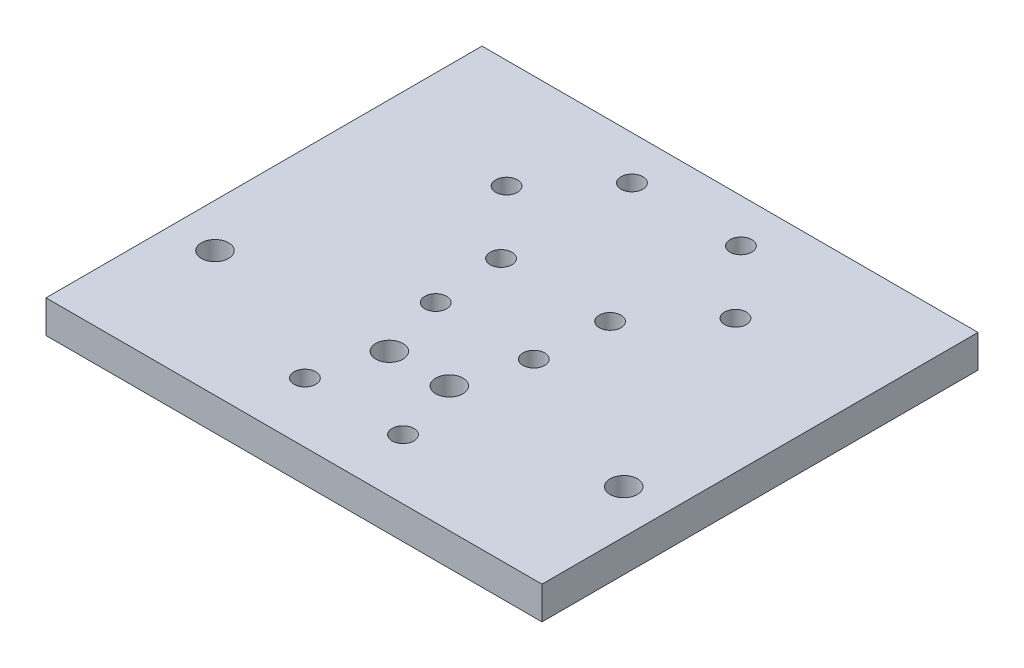
ISO-10303-21;
HEADER;
FILE_DESCRIPTION(('STEP AP214'),'2;1');
FILE_NAME('part.step','',(''),(''),'','','');
FILE_SCHEMA(('AUTOMOTIVE_DESIGN { 1 0 10303 214 1 1 1 1 }'));
ENDSEC;
DATA;
#1=APPLICATION_CONTEXT('core data for automotive mechanical design processes');
#2=APPLICATION_PROTOCOL_DEFINITION('international standard','automotive_design',2000,#1);
#3=PRODUCT_CONTEXT('',#1,'mechanical');
#4=PRODUCT('Part','Part','',(#3));
#5=PRODUCT_RELATED_PRODUCT_CATEGORY('part','',(#4));
#6=PRODUCT_DEFINITION_FORMATION('','',#4);
#7=PRODUCT_DEFINITION_CONTEXT('part definition',#1,'design');
#8=PRODUCT_DEFINITION('design','',#6,#7);
#9=PRODUCT_DEFINITION_SHAPE('','',#8);
#10=(LENGTH_UNIT() NAMED_UNIT(*) SI_UNIT(.MILLI.,.METRE.));
#11=(NAMED_UNIT(*) PLANE_ANGLE_UNIT() SI_UNIT($,.RADIAN.));
#12=(NAMED_UNIT(*) SI_UNIT($,.STERADIAN.) SOLID_ANGLE_UNIT());
#13=UNCERTAINTY_MEASURE_WITH_UNIT(LENGTH_MEASURE(1.E-05),#10,'distance_accuracy_value','');
#14=(GEOMETRIC_REPRESENTATION_CONTEXT(3) GLOBAL_UNCERTAINTY_ASSIGNED_CONTEXT((#13)) GLOBAL_UNIT_ASSIGNED_CONTEXT((#10,
#11,#12)) REPRESENTATION_CONTEXT('',''));
#15=CARTESIAN_POINT('',(0.,0.,0.));
#16=DIRECTION('',(0.,0.,1.));
#17=DIRECTION('',(1.,0.,0.));
#18=AXIS2_PLACEMENT_3D('',#15,#16,#17);
#19=CARTESIAN_POINT('',(104.,0.,0.));
#20=DIRECTION('',(0.,0.,-1.));
#21=DIRECTION('',(-1.,0.,0.));
#22=AXIS2_PLACEMENT_3D('',#19,#20,#21);
#23=PLANE('',#22);
#24=DIRECTION('',(-1.,0.,0.));
#25=VECTOR('',#24,1.);
#26=CARTESIAN_POINT('',(104.,0.,0.));
#27=LINE('',#26,#25);
#28=CARTESIAN_POINT('',(97.5,0.,0.));
#29=VERTEX_POINT('',#28);
#30=CARTESIAN_POINT('',(6.50000000000003,0.,0.));
#31=VERTEX_POINT('',#30);
#32=EDGE_CURVE('E11',#29,#31,#27,.T.);
#33=ORIENTED_EDGE('',*,*,#32,.F.);
#34=DIRECTION('',(0.,1.,0.));
#35=VECTOR('',#34,1.);
#36=CARTESIAN_POINT('',(97.5,0.,0.));
#37=LINE('',#36,#35);
#38=CARTESIAN_POINT('',(97.5,6.,0.));
#39=VERTEX_POINT('',#38);
#40=EDGE_CURVE('E104',#29,#39,#37,.T.);
#41=ORIENTED_EDGE('',*,*,#40,.T.);
#42=DIRECTION('',(-1.,0.,0.));
#43=VECTOR('',#42,1.);
#44=CARTESIAN_POINT('',(104.,6.,0.));
#45=LINE('',#44,#43);
#46=CARTESIAN_POINT('',(6.50000000000005,6.,0.));
#47=VERTEX_POINT('',#46);
#48=EDGE_CURVE('E93',#39,#47,#45,.T.);
#49=ORIENTED_EDGE('',*,*,#48,.T.);
#50=DIRECTION('',(0.,1.,0.));
#51=VECTOR('',#50,1.);
#52=CARTESIAN_POINT('',(6.50000000000003,0.,0.));
#53=LINE('',#52,#51);
#54=EDGE_CURVE('E62',#31,#47,#53,.T.);
#55=ORIENTED_EDGE('',*,*,#54,.F.);
#56=EDGE_LOOP('',(#33,#41,#49,#55));
#57=FACE_BOUND('',#56,.T.);
#58=ADVANCED_FACE('F39',(#57),#23,.F.);
#59=CARTESIAN_POINT('',(104.,0.,0.));
#60=DIRECTION('',(0.,1.,0.));
#61=DIRECTION('',(0.,0.,1.));
#62=AXIS2_PLACEMENT_3D('',#59,#60,#61);
#63=PLANE('',#62);
#64=CARTESIAN_POINT('',(61.,0.,-11.));
#65=DIRECTION('',(0.,1.,0.));
#66=DIRECTION('',(0.,0.,-1.));
#67=AXIS2_PLACEMENT_3D('',#64,#65,#66);
#68=CIRCLE('',#67,2.);
#69=CARTESIAN_POINT('',(61.,0.,-13.));
#70=VERTEX_POINT('',#69);
#71=EDGE_CURVE('E320',#70,#70,#68,.T.);
#72=ORIENTED_EDGE('',*,*,#71,.T.);
#73=EDGE_LOOP('',(#72));
#74=FACE_BOUND('',#73,.T.);
#75=CARTESIAN_POINT('',(61.0000000000001,0.,-35.));
#76=DIRECTION('',(0.,1.,0.));
#77=DIRECTION('',(0.,0.,-1.));
#78=AXIS2_PLACEMENT_3D('',#75,#76,#77);
#79=CIRCLE('',#78,1.99999999999999);
#80=CARTESIAN_POINT('',(61.0000000000001,0.,-37.));
#81=VERTEX_POINT('',#80);
#82=EDGE_CURVE('E312',#81,#81,#79,.T.);
#83=ORIENTED_EDGE('',*,*,#82,.T.);
#84=EDGE_LOOP('',(#83));
#85=FACE_BOUND('',#84,.T.);
#86=CARTESIAN_POINT('',(62.,0.,-48.));
#87=DIRECTION('',(0.,1.,0.));
#88=DIRECTION('',(0.,0.,-1.));
#89=AXIS2_PLACEMENT_3D('',#86,#87,#88);
#90=CIRCLE('',#89,1.99999999999998);
#91=CARTESIAN_POINT('',(62.,0.,-50.));
#92=VERTEX_POINT('',#91);
#93=EDGE_CURVE('E304',#92,#92,#90,.T.);
#94=ORIENTED_EDGE('',*,*,#93,.T.);
#95=EDGE_LOOP('',(#94));
#96=FACE_BOUND('',#95,.T.);
#97=CARTESIAN_POINT('',(62.,0.,-72.));
#98=DIRECTION('',(0.,1.,0.));
#99=DIRECTION('',(0.,0.,-1.));
#100=AXIS2_PLACEMENT_3D('',#97,#98,#99);
#101=CIRCLE('',#100,2.);
#102=CARTESIAN_POINT('',(62.,0.,-74.));
#103=VERTEX_POINT('',#102);
#104=EDGE_CURVE('E228',#103,#103,#101,.T.);
#105=ORIENTED_EDGE('',*,*,#104,.T.);
#106=EDGE_LOOP('',(#105));
#107=FACE_BOUND('',#106,.T.);
#108=CARTESIAN_POINT('',(42.9999999999999,0.,-35.));
#109=DIRECTION('',(0.,1.,0.));
#110=DIRECTION('',(0.,0.,1.));
#111=AXIS2_PLACEMENT_3D('',#108,#109,#110);
#112=CIRCLE('',#111,2.);
#113=CARTESIAN_POINT('',(42.9999999999999,0.,-33.));
#114=VERTEX_POINT('',#113);
#115=EDGE_CURVE('E122',#114,#114,#112,.T.);
#116=ORIENTED_EDGE('',*,*,#115,.T.);
#117=EDGE_LOOP('',(#116));
#118=FACE_BOUND('',#117,.T.);
#119=CARTESIAN_POINT('',(42.,0.,-48.));
#120=DIRECTION('',(0.,1.,0.));
#121=DIRECTION('',(0.,0.,1.));
#122=AXIS2_PLACEMENT_3D('',#119,#120,#121);
#123=CIRCLE('',#122,2.);
#124=CARTESIAN_POINT('',(42.,0.,-46.));
#125=VERTEX_POINT('',#124);
#126=EDGE_CURVE('E106',#125,#125,#123,.T.);
#127=ORIENTED_EDGE('',*,*,#126,.T.);
#128=EDGE_LOOP('',(#127));
#129=FACE_BOUND('',#128,.T.);
#130=CARTESIAN_POINT('',(42.,0.,-72.));
#131=DIRECTION('',(0.,1.,0.));
#132=DIRECTION('',(0.,0.,1.));
#133=AXIS2_PLACEMENT_3D('',#130,#131,#132);
#134=CIRCLE('',#133,2.);
#135=CARTESIAN_POINT('',(42.,0.,-70.));
#136=VERTEX_POINT('',#135);
#137=EDGE_CURVE('E222',#136,#136,#134,.T.);
#138=ORIENTED_EDGE('',*,*,#137,.T.);
#139=EDGE_LOOP('',(#138));
#140=FACE_BOUND('',#139,.T.);
#141=CARTESIAN_POINT('',(73.,0.,-60.));
#142=DIRECTION('',(0.,1.,0.));
#143=DIRECTION('',(0.,0.,1.));
#144=AXIS2_PLACEMENT_3D('',#141,#142,#143);
#145=CIRCLE('',#144,2.);
#146=CARTESIAN_POINT('',(73.,0.,-58.));
#147=VERTEX_POINT('',#146);
#148=EDGE_CURVE('E337',#147,#147,#145,.T.);
#149=ORIENTED_EDGE('',*,*,#148,.T.);
#150=EDGE_LOOP('',(#149));
#151=FACE_BOUND('',#150,.T.);
#152=CARTESIAN_POINT('',(31.,0.,-60.));
#153=DIRECTION('',(0.,1.,0.));
#154=DIRECTION('',(0.,0.,1.));
#155=AXIS2_PLACEMENT_3D('',#152,#153,#154);
#156=CIRCLE('',#155,2.00000000000001);
#157=CARTESIAN_POINT('',(31.,0.,-58.));
#158=VERTEX_POINT('',#157);
#159=EDGE_CURVE('E341',#158,#158,#156,.T.);
#160=ORIENTED_EDGE('',*,*,#159,.T.);
#161=EDGE_LOOP('',(#160));
#162=FACE_BOUND('',#161,.T.);
#163=CARTESIAN_POINT('',(14.5,0.,-23.));
#164=DIRECTION('',(0.,1.,0.));
#165=DIRECTION('',(0.,0.,-1.));
#166=AXIS2_PLACEMENT_3D('',#163,#164,#165);
#167=CIRCLE('',#166,2.5);
#168=CARTESIAN_POINT('',(14.5,0.,-25.5));
#169=VERTEX_POINT('',#168);
#170=EDGE_CURVE('E295',#169,#169,#167,.T.);
#171=ORIENTED_EDGE('',*,*,#170,.T.);
#172=EDGE_LOOP('',(#171));
#173=FACE_BOUND('',#172,.T.);
#174=CARTESIAN_POINT('',(46.5,0.,-23.));
#175=DIRECTION('',(0.,1.,0.));
#176=DIRECTION('',(0.,0.,-1.));
#177=AXIS2_PLACEMENT_3D('',#174,#175,#176);
#178=CIRCLE('',#177,2.49999999999999);
#179=CARTESIAN_POINT('',(46.5,0.,-25.5));
#180=VERTEX_POINT('',#179);
#181=EDGE_CURVE('E289',#180,#180,#178,.T.);
#182=ORIENTED_EDGE('',*,*,#181,.T.);
#183=EDGE_LOOP('',(#182));
#184=FACE_BOUND('',#183,.T.);
#185=CARTESIAN_POINT('',(89.5,0.,-23.));
#186=DIRECTION('',(0.,1.,0.));
#187=DIRECTION('',(0.,0.,1.));
#188=AXIS2_PLACEMENT_3D('',#185,#186,#187);
#189=CIRCLE('',#188,2.5);
#190=CARTESIAN_POINT('',(89.5,0.,-20.5));
#191=VERTEX_POINT('',#190);
#192=EDGE_CURVE('E276',#191,#191,#189,.T.);
#193=ORIENTED_EDGE('',*,*,#192,.T.);
#194=EDGE_LOOP('',(#193));
#195=FACE_BOUND('',#194,.T.);
#196=CARTESIAN_POINT('',(57.5,0.,-23.));
#197=DIRECTION('',(0.,1.,0.));
#198=DIRECTION('',(0.,0.,1.));
#199=AXIS2_PLACEMENT_3D('',#196,#197,#198);
#200=CIRCLE('',#199,2.49999999999999);
#201=CARTESIAN_POINT('',(57.5,0.,-20.5));
#202=VERTEX_POINT('',#201);
#203=EDGE_CURVE('E275',#202,#202,#200,.T.);
#204=ORIENTED_EDGE('',*,*,#203,.T.);
#205=EDGE_LOOP('',(#204));
#206=FACE_BOUND('',#205,.T.);
#207=CARTESIAN_POINT('',(43.,0.,-11.));
#208=DIRECTION('',(0.,1.,0.));
#209=DIRECTION('',(0.,0.,1.));
#210=AXIS2_PLACEMENT_3D('',#207,#208,#209);
#211=CIRCLE('',#210,2.);
#212=CARTESIAN_POINT('',(43.,0.,-9.00000000000001));
#213=VERTEX_POINT('',#212);
#214=EDGE_CURVE('E114',#213,#213,#211,.T.);
#215=ORIENTED_EDGE('',*,*,#214,.T.);
#216=EDGE_LOOP('',(#215));
#217=FACE_BOUND('',#216,.T.);
#218=DIRECTION('',(-1.,0.,0.));
#219=VECTOR('',#218,1.);
#220=CARTESIAN_POINT('',(104.,0.,-80.));
#221=LINE('',#220,#219);
#222=CARTESIAN_POINT('',(97.5,0.,-80.));
#223=VERTEX_POINT('',#222);
#224=CARTESIAN_POINT('',(6.50000000000002,0.,-80.));
#225=VERTEX_POINT('',#224);
#226=EDGE_CURVE('E47',#223,#225,#221,.T.);
#227=ORIENTED_EDGE('',*,*,#226,.F.);
#228=DIRECTION('',(0.,0.,1.));
#229=VECTOR('',#228,1.);
#230=CARTESIAN_POINT('',(97.5,0.,-80.));
#231=LINE('',#230,#229);
#232=EDGE_CURVE('E98',#223,#29,#231,.T.);
#233=ORIENTED_EDGE('',*,*,#232,.T.);
#234=ORIENTED_EDGE('',*,*,#32,.T.);
#235=DIRECTION('',(0.,0.,-1.));
#236=VECTOR('',#235,1.);
#237=CARTESIAN_POINT('',(6.50000000000002,0.,-80.));
#238=LINE('',#237,#236);
#239=EDGE_CURVE('E78',#31,#225,#238,.T.);
#240=ORIENTED_EDGE('',*,*,#239,.T.);
#241=EDGE_LOOP('',(#227,#233,#234,#240));
#242=FACE_BOUND('',#241,.T.);
#243=ADVANCED_FACE('F97',(#74,#85,#96,#107,#118,#129,#140,#151,#162,#173,#184,#195,#206,#217,
#242),#63,.F.);
#244=CARTESIAN_POINT('',(104.,0.,-80.));
#245=DIRECTION('',(0.,0.,1.));
#246=DIRECTION('',(1.,0.,0.));
#247=AXIS2_PLACEMENT_3D('',#244,#245,#246);
#248=PLANE('',#247);
#249=DIRECTION('',(-1.,0.,0.));
#250=VECTOR('',#249,1.);
#251=CARTESIAN_POINT('',(104.,6.,-80.));
#252=LINE('',#251,#250);
#253=CARTESIAN_POINT('',(97.5,6.,-80.));
#254=VERTEX_POINT('',#253);
#255=CARTESIAN_POINT('',(6.50000000000002,6.,-80.));
#256=VERTEX_POINT('',#255);
#257=EDGE_CURVE('E125',#254,#256,#252,.T.);
#258=ORIENTED_EDGE('',*,*,#257,.F.);
#259=DIRECTION('',(0.,1.,0.));
#260=VECTOR('',#259,1.);
#261=CARTESIAN_POINT('',(97.5,0.,-80.));
#262=LINE('',#261,#260);
#263=EDGE_CURVE('E54',#223,#254,#262,.T.);
#264=ORIENTED_EDGE('',*,*,#263,.F.);
#265=ORIENTED_EDGE('',*,*,#226,.T.);
#266=DIRECTION('',(0.,1.,0.));
#267=VECTOR('',#266,1.);
#268=CARTESIAN_POINT('',(6.50000000000002,0.,-80.));
#269=LINE('',#268,#267);
#270=EDGE_CURVE('E81',#225,#256,#269,.T.);
#271=ORIENTED_EDGE('',*,*,#270,.T.);
#272=EDGE_LOOP('',(#258,#264,#265,#271));
#273=FACE_BOUND('',#272,.T.);
#274=ADVANCED_FACE('F131',(#273),#248,.F.);
#275=CARTESIAN_POINT('',(104.,6.,0.));
#276=DIRECTION('',(0.,-1.,0.));
#277=DIRECTION('',(0.,0.,-1.));
#278=AXIS2_PLACEMENT_3D('',#275,#276,#277);
#279=PLANE('',#278);
#280=CARTESIAN_POINT('',(61.,6.,-11.));
#281=DIRECTION('',(0.,1.,0.));
#282=DIRECTION('',(0.,0.,-1.));
#283=AXIS2_PLACEMENT_3D('',#280,#281,#282);
#284=CIRCLE('',#283,2.);
#285=CARTESIAN_POINT('',(61.,6.,-13.));
#286=VERTEX_POINT('',#285);
#287=EDGE_CURVE('E281',#286,#286,#284,.T.);
#288=ORIENTED_EDGE('',*,*,#287,.F.);
#289=EDGE_LOOP('',(#288));
#290=FACE_BOUND('',#289,.T.);
#291=CARTESIAN_POINT('',(61.0000000000001,6.,-35.));
#292=DIRECTION('',(0.,1.,0.));
#293=DIRECTION('',(0.,0.,-1.));
#294=AXIS2_PLACEMENT_3D('',#291,#292,#293);
#295=CIRCLE('',#294,1.99999999999999);
#296=CARTESIAN_POINT('',(61.0000000000001,6.,-37.));
#297=VERTEX_POINT('',#296);
#298=EDGE_CURVE('E316',#297,#297,#295,.T.);
#299=ORIENTED_EDGE('',*,*,#298,.F.);
#300=EDGE_LOOP('',(#299));
#301=FACE_BOUND('',#300,.T.);
#302=CARTESIAN_POINT('',(62.,6.,-48.));
#303=DIRECTION('',(0.,1.,0.));
#304=DIRECTION('',(0.,0.,-1.));
#305=AXIS2_PLACEMENT_3D('',#302,#303,#304);
#306=CIRCLE('',#305,1.99999999999998);
#307=CARTESIAN_POINT('',(62.,6.,-50.));
#308=VERTEX_POINT('',#307);
#309=EDGE_CURVE('E308',#308,#308,#306,.T.);
#310=ORIENTED_EDGE('',*,*,#309,.F.);
#311=EDGE_LOOP('',(#310));
#312=FACE_BOUND('',#311,.T.);
#313=CARTESIAN_POINT('',(62.,6.,-72.));
#314=DIRECTION('',(0.,1.,0.));
#315=DIRECTION('',(0.,0.,-1.));
#316=AXIS2_PLACEMENT_3D('',#313,#314,#315);
#317=CIRCLE('',#316,2.);
#318=CARTESIAN_POINT('',(62.,6.,-74.));
#319=VERTEX_POINT('',#318);
#320=EDGE_CURVE('E235',#319,#319,#317,.T.);
#321=ORIENTED_EDGE('',*,*,#320,.F.);
#322=EDGE_LOOP('',(#321));
#323=FACE_BOUND('',#322,.T.);
#324=CARTESIAN_POINT('',(42.9999999999999,6.,-35.));
#325=DIRECTION('',(0.,1.,0.));
#326=DIRECTION('',(0.,0.,1.));
#327=AXIS2_PLACEMENT_3D('',#324,#325,#326);
#328=CIRCLE('',#327,2.);
#329=CARTESIAN_POINT('',(42.9999999999999,6.,-33.));
#330=VERTEX_POINT('',#329);
#331=EDGE_CURVE('E109',#330,#330,#328,.T.);
#332=ORIENTED_EDGE('',*,*,#331,.F.);
#333=EDGE_LOOP('',(#332));
#334=FACE_BOUND('',#333,.T.);
#335=CARTESIAN_POINT('',(42.,6.,-48.));
#336=DIRECTION('',(0.,1.,0.));
#337=DIRECTION('',(0.,0.,1.));
#338=AXIS2_PLACEMENT_3D('',#335,#336,#337);
#339=CIRCLE('',#338,2.);
#340=CARTESIAN_POINT('',(42.,6.,-46.));
#341=VERTEX_POINT('',#340);
#342=EDGE_CURVE('E232',#341,#341,#339,.T.);
#343=ORIENTED_EDGE('',*,*,#342,.F.);
#344=EDGE_LOOP('',(#343));
#345=FACE_BOUND('',#344,.T.);
#346=CARTESIAN_POINT('',(42.,6.,-72.));
#347=DIRECTION('',(0.,1.,0.));
#348=DIRECTION('',(0.,0.,1.));
#349=AXIS2_PLACEMENT_3D('',#346,#347,#348);
#350=CIRCLE('',#349,2.);
#351=CARTESIAN_POINT('',(42.,6.,-70.));
#352=VERTEX_POINT('',#351);
#353=EDGE_CURVE('E225',#352,#352,#350,.T.);
#354=ORIENTED_EDGE('',*,*,#353,.F.);
#355=EDGE_LOOP('',(#354));
#356=FACE_BOUND('',#355,.T.);
#357=CARTESIAN_POINT('',(73.,6.,-60.));
#358=DIRECTION('',(0.,1.,0.));
#359=DIRECTION('',(0.,0.,1.));
#360=AXIS2_PLACEMENT_3D('',#357,#358,#359);
#361=CIRCLE('',#360,2.);
#362=CARTESIAN_POINT('',(73.,6.,-58.));
#363=VERTEX_POINT('',#362);
#364=EDGE_CURVE('E254',#363,#363,#361,.T.);
#365=ORIENTED_EDGE('',*,*,#364,.F.);
#366=EDGE_LOOP('',(#365));
#367=FACE_BOUND('',#366,.T.);
#368=CARTESIAN_POINT('',(31.,6.,-60.));
#369=DIRECTION('',(0.,1.,0.));
#370=DIRECTION('',(0.,0.,1.));
#371=AXIS2_PLACEMENT_3D('',#368,#369,#370);
#372=CIRCLE('',#371,2.00000000000001);
#373=CARTESIAN_POINT('',(31.,6.,-58.));
#374=VERTEX_POINT('',#373);
#375=EDGE_CURVE('E258',#374,#374,#372,.T.);
#376=ORIENTED_EDGE('',*,*,#375,.F.);
#377=EDGE_LOOP('',(#376));
#378=FACE_BOUND('',#377,.T.);
#379=CARTESIAN_POINT('',(14.5,6.,-23.));
#380=DIRECTION('',(0.,1.,0.));
#381=DIRECTION('',(0.,0.,-1.));
#382=AXIS2_PLACEMENT_3D('',#379,#380,#381);
#383=CIRCLE('',#382,2.5);
#384=CARTESIAN_POINT('',(14.5,6.,-25.5));
#385=VERTEX_POINT('',#384);
#386=EDGE_CURVE('E262',#385,#385,#383,.T.);
#387=ORIENTED_EDGE('',*,*,#386,.F.);
#388=EDGE_LOOP('',(#387));
#389=FACE_BOUND('',#388,.T.);
#390=CARTESIAN_POINT('',(46.5,6.,-23.));
#391=DIRECTION('',(0.,1.,0.));
#392=DIRECTION('',(0.,0.,-1.));
#393=AXIS2_PLACEMENT_3D('',#390,#391,#392);
#394=CIRCLE('',#393,2.49999999999999);
#395=CARTESIAN_POINT('',(46.5,6.,-25.5));
#396=VERTEX_POINT('',#395);
#397=EDGE_CURVE('E266',#396,#396,#394,.T.);
#398=ORIENTED_EDGE('',*,*,#397,.F.);
#399=EDGE_LOOP('',(#398));
#400=FACE_BOUND('',#399,.T.);
#401=CARTESIAN_POINT('',(89.5,6.,-23.));
#402=DIRECTION('',(0.,1.,0.));
#403=DIRECTION('',(0.,0.,1.));
#404=AXIS2_PLACEMENT_3D('',#401,#402,#403);
#405=CIRCLE('',#404,2.5);
#406=CARTESIAN_POINT('',(89.5,6.,-20.5));
#407=VERTEX_POINT('',#406);
#408=EDGE_CURVE('E270',#407,#407,#405,.T.);
#409=ORIENTED_EDGE('',*,*,#408,.F.);
#410=EDGE_LOOP('',(#409));
#411=FACE_BOUND('',#410,.T.);
#412=CARTESIAN_POINT('',(57.5,6.,-23.));
#413=DIRECTION('',(0.,1.,0.));
#414=DIRECTION('',(0.,0.,1.));
#415=AXIS2_PLACEMENT_3D('',#412,#413,#414);
#416=CIRCLE('',#415,2.49999999999999);
#417=CARTESIAN_POINT('',(57.5,6.,-20.5));
#418=VERTEX_POINT('',#417);
#419=EDGE_CURVE('E273',#418,#418,#416,.T.);
#420=ORIENTED_EDGE('',*,*,#419,.F.);
#421=EDGE_LOOP('',(#420));
#422=FACE_BOUND('',#421,.T.);
#423=CARTESIAN_POINT('',(43.,6.,-11.));
#424=DIRECTION('',(0.,1.,0.));
#425=DIRECTION('',(0.,0.,1.));
#426=AXIS2_PLACEMENT_3D('',#423,#424,#425);
#427=CIRCLE('',#426,2.);
#428=CARTESIAN_POINT('',(43.,6.,-9.00000000000001));
#429=VERTEX_POINT('',#428);
#430=EDGE_CURVE('E118',#429,#429,#427,.T.);
#431=ORIENTED_EDGE('',*,*,#430,.F.);
#432=EDGE_LOOP('',(#431));
#433=FACE_BOUND('',#432,.T.);
#434=ORIENTED_EDGE('',*,*,#48,.F.);
#435=DIRECTION('',(0.,0.,1.));
#436=VECTOR('',#435,1.);
#437=CARTESIAN_POINT('',(97.5,6.,-80.));
#438=LINE('',#437,#436);
#439=EDGE_CURVE('E100',#254,#39,#438,.T.);
#440=ORIENTED_EDGE('',*,*,#439,.F.);
#441=ORIENTED_EDGE('',*,*,#257,.T.);
#442=DIRECTION('',(0.,0.,-1.));
#443=VECTOR('',#442,1.);
#444=CARTESIAN_POINT('',(6.50000000000002,6.,-80.));
#445=LINE('',#444,#443);
#446=EDGE_CURVE('E86',#47,#256,#445,.T.);
#447=ORIENTED_EDGE('',*,*,#446,.F.);
#448=EDGE_LOOP('',(#434,#440,#441,#447));
#449=FACE_BOUND('',#448,.T.);
#450=ADVANCED_FACE('F133',(#290,#301,#312,#323,#334,#345,#356,#367,#378,#389,#400,#411,#422,
#433,#449),#279,.F.);
#451=CARTESIAN_POINT('',(43.,0.,-11.));
#452=DIRECTION('',(0.,1.,0.));
#453=DIRECTION('',(0.,0.,1.));
#454=AXIS2_PLACEMENT_3D('',#451,#452,#453);
#455=CYLINDRICAL_SURFACE('',#454,2.);
#456=ORIENTED_EDGE('',*,*,#214,.F.);
#457=EDGE_LOOP('',(#456));
#458=FACE_BOUND('',#457,.T.);
#459=ORIENTED_EDGE('',*,*,#430,.T.);
#460=EDGE_LOOP('',(#459));
#461=FACE_BOUND('',#460,.T.);
#462=ADVANCED_FACE('F163',(#458,#461),#455,.F.);
#463=CARTESIAN_POINT('',(57.5,0.,-23.));
#464=DIRECTION('',(0.,1.,0.));
#465=DIRECTION('',(0.,0.,1.));
#466=AXIS2_PLACEMENT_3D('',#463,#464,#465);
#467=CYLINDRICAL_SURFACE('',#466,2.49999999999999);
#468=ORIENTED_EDGE('',*,*,#203,.F.);
#469=EDGE_LOOP('',(#468));
#470=FACE_BOUND('',#469,.T.);
#471=ORIENTED_EDGE('',*,*,#419,.T.);
#472=EDGE_LOOP('',(#471));
#473=FACE_BOUND('',#472,.T.);
#474=ADVANCED_FACE('F166',(#470,#473),#467,.F.);
#475=CARTESIAN_POINT('',(89.5,0.,-23.));
#476=DIRECTION('',(0.,1.,0.));
#477=DIRECTION('',(0.,0.,1.));
#478=AXIS2_PLACEMENT_3D('',#475,#476,#477);
#479=CYLINDRICAL_SURFACE('',#478,2.5);
#480=ORIENTED_EDGE('',*,*,#192,.F.);
#481=EDGE_LOOP('',(#480));
#482=FACE_BOUND('',#481,.T.);
#483=ORIENTED_EDGE('',*,*,#408,.T.);
#484=EDGE_LOOP('',(#483));
#485=FACE_BOUND('',#484,.T.);
#486=ADVANCED_FACE('F171',(#482,#485),#479,.F.);
#487=CARTESIAN_POINT('',(46.5,0.,-23.));
#488=DIRECTION('',(0.,1.,0.));
#489=DIRECTION('',(0.,0.,1.));
#490=AXIS2_PLACEMENT_3D('',#487,#488,#489);
#491=CYLINDRICAL_SURFACE('',#490,2.49999999999999);
#492=ORIENTED_EDGE('',*,*,#181,.F.);
#493=EDGE_LOOP('',(#492));
#494=FACE_BOUND('',#493,.T.);
#495=ORIENTED_EDGE('',*,*,#397,.T.);
#496=EDGE_LOOP('',(#495));
#497=FACE_BOUND('',#496,.T.);
#498=ADVANCED_FACE('F182',(#494,#497),#491,.F.);
#499=CARTESIAN_POINT('',(14.5,0.,-23.));
#500=DIRECTION('',(0.,1.,0.));
#501=DIRECTION('',(0.,0.,1.));
#502=AXIS2_PLACEMENT_3D('',#499,#500,#501);
#503=CYLINDRICAL_SURFACE('',#502,2.5);
#504=ORIENTED_EDGE('',*,*,#170,.F.);
#505=EDGE_LOOP('',(#504));
#506=FACE_BOUND('',#505,.T.);
#507=ORIENTED_EDGE('',*,*,#386,.T.);
#508=EDGE_LOOP('',(#507));
#509=FACE_BOUND('',#508,.T.);
#510=ADVANCED_FACE('F193',(#506,#509),#503,.F.);
#511=CARTESIAN_POINT('',(31.,0.,-60.));
#512=DIRECTION('',(0.,1.,0.));
#513=DIRECTION('',(0.,0.,1.));
#514=AXIS2_PLACEMENT_3D('',#511,#512,#513);
#515=CYLINDRICAL_SURFACE('',#514,2.00000000000001);
#516=ORIENTED_EDGE('',*,*,#159,.F.);
#517=EDGE_LOOP('',(#516));
#518=FACE_BOUND('',#517,.T.);
#519=ORIENTED_EDGE('',*,*,#375,.T.);
#520=EDGE_LOOP('',(#519));
#521=FACE_BOUND('',#520,.T.);
#522=ADVANCED_FACE('F197',(#518,#521),#515,.F.);
#523=CARTESIAN_POINT('',(73.,0.,-60.));
#524=DIRECTION('',(0.,1.,0.));
#525=DIRECTION('',(0.,0.,1.));
#526=AXIS2_PLACEMENT_3D('',#523,#524,#525);
#527=CYLINDRICAL_SURFACE('',#526,2.);
#528=ORIENTED_EDGE('',*,*,#148,.F.);
#529=EDGE_LOOP('',(#528));
#530=FACE_BOUND('',#529,.T.);
#531=ORIENTED_EDGE('',*,*,#364,.T.);
#532=EDGE_LOOP('',(#531));
#533=FACE_BOUND('',#532,.T.);
#534=ADVANCED_FACE('F188',(#530,#533),#527,.F.);
#535=CARTESIAN_POINT('',(6.50000000000002,0.,-80.));
#536=DIRECTION('',(1.,0.,0.));
#537=DIRECTION('',(0.,0.,-1.));
#538=AXIS2_PLACEMENT_3D('',#535,#536,#537);
#539=PLANE('',#538);
#540=ORIENTED_EDGE('',*,*,#446,.T.);
#541=ORIENTED_EDGE('',*,*,#270,.F.);
#542=ORIENTED_EDGE('',*,*,#239,.F.);
#543=ORIENTED_EDGE('',*,*,#54,.T.);
#544=EDGE_LOOP('',(#540,#541,#542,#543));
#545=FACE_BOUND('',#544,.T.);
#546=ADVANCED_FACE('F79',(#545),#539,.F.);
#547=CARTESIAN_POINT('',(42.,0.,-72.));
#548=DIRECTION('',(0.,1.,0.));
#549=DIRECTION('',(0.,0.,1.));
#550=AXIS2_PLACEMENT_3D('',#547,#548,#549);
#551=CYLINDRICAL_SURFACE('',#550,2.);
#552=ORIENTED_EDGE('',*,*,#137,.F.);
#553=EDGE_LOOP('',(#552));
#554=FACE_BOUND('',#553,.T.);
#555=ORIENTED_EDGE('',*,*,#353,.T.);
#556=EDGE_LOOP('',(#555));
#557=FACE_BOUND('',#556,.T.);
#558=ADVANCED_FACE('F146',(#554,#557),#551,.F.);
#559=CARTESIAN_POINT('',(42.,0.,-48.));
#560=DIRECTION('',(0.,1.,0.));
#561=DIRECTION('',(0.,0.,1.));
#562=AXIS2_PLACEMENT_3D('',#559,#560,#561);
#563=CYLINDRICAL_SURFACE('',#562,2.);
#564=ORIENTED_EDGE('',*,*,#126,.F.);
#565=EDGE_LOOP('',(#564));
#566=FACE_BOUND('',#565,.T.);
#567=ORIENTED_EDGE('',*,*,#342,.T.);
#568=EDGE_LOOP('',(#567));
#569=FACE_BOUND('',#568,.T.);
#570=ADVANCED_FACE('F137',(#566,#569),#563,.F.);
#571=CARTESIAN_POINT('',(97.5,0.,-80.));
#572=DIRECTION('',(-1.,0.,0.));
#573=DIRECTION('',(0.,0.,1.));
#574=AXIS2_PLACEMENT_3D('',#571,#572,#573);
#575=PLANE('',#574);
#576=ORIENTED_EDGE('',*,*,#439,.T.);
#577=ORIENTED_EDGE('',*,*,#40,.F.);
#578=ORIENTED_EDGE('',*,*,#232,.F.);
#579=ORIENTED_EDGE('',*,*,#263,.T.);
#580=EDGE_LOOP('',(#576,#577,#578,#579));
#581=FACE_BOUND('',#580,.T.);
#582=ADVANCED_FACE('F134',(#581),#575,.F.);
#583=CARTESIAN_POINT('',(42.9999999999999,0.,-35.));
#584=DIRECTION('',(0.,1.,0.));
#585=DIRECTION('',(0.,0.,1.));
#586=AXIS2_PLACEMENT_3D('',#583,#584,#585);
#587=CYLINDRICAL_SURFACE('',#586,2.);
#588=ORIENTED_EDGE('',*,*,#115,.F.);
#589=EDGE_LOOP('',(#588));
#590=FACE_BOUND('',#589,.T.);
#591=ORIENTED_EDGE('',*,*,#331,.T.);
#592=EDGE_LOOP('',(#591));
#593=FACE_BOUND('',#592,.T.);
#594=ADVANCED_FACE('F136',(#590,#593),#587,.F.);
#595=CARTESIAN_POINT('',(62.,0.,-72.));
#596=DIRECTION('',(0.,1.,0.));
#597=DIRECTION('',(0.,0.,1.));
#598=AXIS2_PLACEMENT_3D('',#595,#596,#597);
#599=CYLINDRICAL_SURFACE('',#598,2.);
#600=ORIENTED_EDGE('',*,*,#104,.F.);
#601=EDGE_LOOP('',(#600));
#602=FACE_BOUND('',#601,.T.);
#603=ORIENTED_EDGE('',*,*,#320,.T.);
#604=EDGE_LOOP('',(#603));
#605=FACE_BOUND('',#604,.T.);
#606=ADVANCED_FACE('F143',(#602,#605),#599,.F.);
#607=CARTESIAN_POINT('',(62.,0.,-48.));
#608=DIRECTION('',(0.,1.,0.));
#609=DIRECTION('',(0.,0.,1.));
#610=AXIS2_PLACEMENT_3D('',#607,#608,#609);
#611=CYLINDRICAL_SURFACE('',#610,1.99999999999998);
#612=ORIENTED_EDGE('',*,*,#93,.F.);
#613=EDGE_LOOP('',(#612));
#614=FACE_BOUND('',#613,.T.);
#615=ORIENTED_EDGE('',*,*,#309,.T.);
#616=EDGE_LOOP('',(#615));
#617=FACE_BOUND('',#616,.T.);
#618=ADVANCED_FACE('F201',(#614,#617),#611,.F.);
#619=CARTESIAN_POINT('',(61.0000000000001,0.,-35.));
#620=DIRECTION('',(0.,1.,0.));
#621=DIRECTION('',(0.,0.,1.));
#622=AXIS2_PLACEMENT_3D('',#619,#620,#621);
#623=CYLINDRICAL_SURFACE('',#622,1.99999999999999);
#624=ORIENTED_EDGE('',*,*,#82,.F.);
#625=EDGE_LOOP('',(#624));
#626=FACE_BOUND('',#625,.T.);
#627=ORIENTED_EDGE('',*,*,#298,.T.);
#628=EDGE_LOOP('',(#627));
#629=FACE_BOUND('',#628,.T.);
#630=ADVANCED_FACE('F205',(#626,#629),#623,.F.);
#631=CARTESIAN_POINT('',(61.,0.,-11.));
#632=DIRECTION('',(0.,1.,0.));
#633=DIRECTION('',(0.,0.,1.));
#634=AXIS2_PLACEMENT_3D('',#631,#632,#633);
#635=CYLINDRICAL_SURFACE('',#634,2.);
#636=ORIENTED_EDGE('',*,*,#71,.F.);
#637=EDGE_LOOP('',(#636));
#638=FACE_BOUND('',#637,.T.);
#639=ORIENTED_EDGE('',*,*,#287,.T.);
#640=EDGE_LOOP('',(#639));
#641=FACE_BOUND('',#640,.T.);
#642=ADVANCED_FACE('F209',(#638,#641),#635,.F.);
#643=CLOSED_SHELL('',(#58,#243,#274,#450,#462,#474,#486,#498,#510,#522,#534,#546,#558,#570,#582,
#594,#606,#618,#630,#642));
#644=MANIFOLD_SOLID_BREP('B2',#643);
#645=ADVANCED_BREP_SHAPE_REPRESENTATION('',(#18,#644),#14);
#646=SHAPE_DEFINITION_REPRESENTATION(#9,#645);
ENDSEC;
END-ISO-10303-21;
